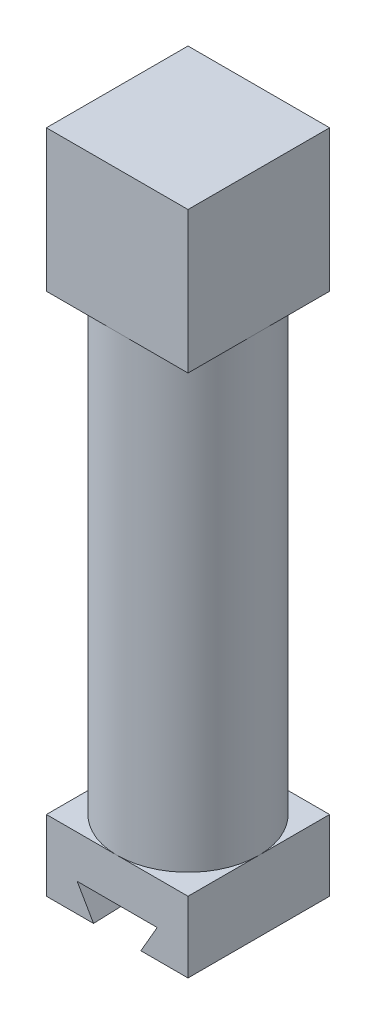
ISO-10303-21;
HEADER;
FILE_DESCRIPTION(('STEP AP214'),'2;1');
FILE_NAME('part.step','',(''),(''),'','','');
FILE_SCHEMA(('AUTOMOTIVE_DESIGN { 1 0 10303 214 1 1 1 1 }'));
ENDSEC;
DATA;
#1=APPLICATION_CONTEXT('core data for automotive mechanical design processes');
#2=APPLICATION_PROTOCOL_DEFINITION('international standard','automotive_design',2000,#1);
#3=PRODUCT_CONTEXT('',#1,'mechanical');
#4=PRODUCT('Part','Part','',(#3));
#5=PRODUCT_RELATED_PRODUCT_CATEGORY('part','',(#4));
#6=PRODUCT_DEFINITION_FORMATION('','',#4);
#7=PRODUCT_DEFINITION_CONTEXT('part definition',#1,'design');
#8=PRODUCT_DEFINITION('design','',#6,#7);
#9=PRODUCT_DEFINITION_SHAPE('','',#8);
#10=(LENGTH_UNIT() NAMED_UNIT(*) SI_UNIT(.MILLI.,.METRE.));
#11=(NAMED_UNIT(*) PLANE_ANGLE_UNIT() SI_UNIT($,.RADIAN.));
#12=(NAMED_UNIT(*) SI_UNIT($,.STERADIAN.) SOLID_ANGLE_UNIT());
#13=UNCERTAINTY_MEASURE_WITH_UNIT(LENGTH_MEASURE(1.E-05),#10,'distance_accuracy_value','');
#14=(GEOMETRIC_REPRESENTATION_CONTEXT(3) GLOBAL_UNCERTAINTY_ASSIGNED_CONTEXT((#13)) GLOBAL_UNIT_ASSIGNED_CONTEXT((#10,
#11,#12)) REPRESENTATION_CONTEXT('',''));
#15=CARTESIAN_POINT('',(0.,0.,0.));
#16=DIRECTION('',(0.,0.,1.));
#17=DIRECTION('',(1.,0.,0.));
#18=AXIS2_PLACEMENT_3D('',#15,#16,#17);
#19=CARTESIAN_POINT('',(7.93750000000012,73.0250002453149,-7.93750000000003));
#20=DIRECTION('',(0.,1.,0.));
#21=DIRECTION('',(0.,0.,1.));
#22=AXIS2_PLACEMENT_3D('',#19,#20,#21);
#23=PLANE('',#22);
#24=DIRECTION('',(-1.,0.,0.));
#25=VECTOR('',#24,1.);
#26=CARTESIAN_POINT('',(7.93750000000012,73.0250002453149,-7.93750000000003));
#27=LINE('',#26,#25);
#28=CARTESIAN_POINT('',(-7.93749999999988,73.0250002453149,-7.93750000000003));
#29=VERTEX_POINT('',#28);
#30=CARTESIAN_POINT('',(7.93750000000012,73.0250002453149,-7.93750000000003));
#31=VERTEX_POINT('',#30);
#32=EDGE_CURVE('E136',#29,#31,#27,.F.);
#33=ORIENTED_EDGE('',*,*,#32,.F.);
#34=DIRECTION('',(0.,0.,1.));
#35=VECTOR('',#34,1.);
#36=CARTESIAN_POINT('',(-7.93749999999988,73.0250002453149,-7.93750000000003));
#37=LINE('',#36,#35);
#38=CARTESIAN_POINT('',(-7.93749999999988,73.0250002453149,7.93749999999996));
#39=VERTEX_POINT('',#38);
#40=EDGE_CURVE('E173',#39,#29,#37,.F.);
#41=ORIENTED_EDGE('',*,*,#40,.F.);
#42=DIRECTION('',(-1.,0.,0.));
#43=VECTOR('',#42,1.);
#44=CARTESIAN_POINT('',(7.93750000000012,73.0250002453149,7.93749999999997));
#45=LINE('',#44,#43);
#46=CARTESIAN_POINT('',(7.93750000000012,73.0250002453149,7.93749999999997));
#47=VERTEX_POINT('',#46);
#48=EDGE_CURVE('E152',#39,#47,#45,.F.);
#49=ORIENTED_EDGE('',*,*,#48,.T.);
#50=DIRECTION('',(0.,0.,1.));
#51=VECTOR('',#50,1.);
#52=CARTESIAN_POINT('',(7.93750000000012,73.0250002453149,-7.93750000000003));
#53=LINE('',#52,#51);
#54=EDGE_CURVE('E151',#31,#47,#53,.T.);
#55=ORIENTED_EDGE('',*,*,#54,.F.);
#56=EDGE_LOOP('',(#33,#41,#49,#55));
#57=FACE_BOUND('',#56,.T.);
#58=ADVANCED_FACE('F18',(#57),#23,.T.);
#59=CARTESIAN_POINT('',(7.93750000000012,57.1500002453149,-7.93750000000003));
#60=DIRECTION('',(0.,0.,-1.));
#61=DIRECTION('',(-1.,0.,0.));
#62=AXIS2_PLACEMENT_3D('',#59,#60,#61);
#63=PLANE('',#62);
#64=DIRECTION('',(1.,0.,0.));
#65=VECTOR('',#64,1.);
#66=CARTESIAN_POINT('',(-7.93749999999988,57.1500002453149,-7.93750000000003));
#67=LINE('',#66,#65);
#68=CARTESIAN_POINT('',(-7.93749999999988,57.1500002453149,-7.93750000000003));
#69=VERTEX_POINT('',#68);
#70=CARTESIAN_POINT('',(0.,57.1500002453149,-7.93750000000002));
#71=VERTEX_POINT('',#70);
#72=EDGE_CURVE('E549',#69,#71,#67,.T.);
#73=ORIENTED_EDGE('',*,*,#72,.F.);
#74=DIRECTION('',(0.,1.,0.));
#75=VECTOR('',#74,1.);
#76=CARTESIAN_POINT('',(-7.93749999999988,73.0250002453149,-7.93750000000003));
#77=LINE('',#76,#75);
#78=EDGE_CURVE('E143',#29,#69,#77,.F.);
#79=ORIENTED_EDGE('',*,*,#78,.F.);
#80=ORIENTED_EDGE('',*,*,#32,.T.);
#81=DIRECTION('',(0.,1.,0.));
#82=VECTOR('',#81,1.);
#83=CARTESIAN_POINT('',(7.93750000000012,57.1500002453149,-7.93750000000003));
#84=LINE('',#83,#82);
#85=CARTESIAN_POINT('',(7.93750000000012,57.1500002453149,-7.93750000000003));
#86=VERTEX_POINT('',#85);
#87=EDGE_CURVE('E141',#86,#31,#84,.T.);
#88=ORIENTED_EDGE('',*,*,#87,.F.);
#89=DIRECTION('',(1.,0.,0.));
#90=VECTOR('',#89,1.);
#91=CARTESIAN_POINT('',(-7.93749999999988,57.1500002453149,-7.93750000000003));
#92=LINE('',#91,#90);
#93=EDGE_CURVE('E545',#71,#86,#92,.T.);
#94=ORIENTED_EDGE('',*,*,#93,.F.);
#95=EDGE_LOOP('',(#73,#79,#80,#88,#94));
#96=FACE_BOUND('',#95,.T.);
#97=ADVANCED_FACE('F139',(#96),#63,.T.);
#98=CARTESIAN_POINT('',(-7.93750031779463,-1.58749948953488,-7.9375));
#99=DIRECTION('',(0.,-1.,-2.44288301531891E-08));
#100=DIRECTION('',(0.,2.44288301531891E-08,-1.));
#101=AXIS2_PLACEMENT_3D('',#98,#99,#100);
#102=PLANE('',#101);
#103=DIRECTION('',(1.,0.,0.));
#104=VECTOR('',#103,1.);
#105=CARTESIAN_POINT('',(-9.53384196111795E-07,-1.58749987734256,7.9375));
#106=LINE('',#105,#104);
#107=CARTESIAN_POINT('',(-7.9375009533842,-1.58749974807333,7.9375));
#108=VERTEX_POINT('',#107);
#109=CARTESIAN_POINT('',(-2.65223024086649,-1.58749987734255,7.9375));
#110=VERTEX_POINT('',#109);
#111=EDGE_CURVE('E518',#108,#110,#106,.T.);
#112=ORIENTED_EDGE('',*,*,#111,.F.);
#113=DIRECTION('',(-4.00371376940711E-08,0.,0.999999999999999));
#114=VECTOR('',#113,1.);
#115=CARTESIAN_POINT('',(-7.93750031779463,-1.58749948953488,-7.9375));
#116=LINE('',#115,#114);
#117=CARTESIAN_POINT('',(-7.93750031779463,-1.58749948953488,-7.9375));
#118=VERTEX_POINT('',#117);
#119=EDGE_CURVE('E520',#118,#108,#116,.T.);
#120=ORIENTED_EDGE('',*,*,#119,.F.);
#121=DIRECTION('',(1.,0.,0.));
#122=VECTOR('',#121,1.);
#123=CARTESIAN_POINT('',(-3.17794646498282E-07,-1.58749948953488,-7.9375));
#124=LINE('',#123,#122);
#125=CARTESIAN_POINT('',(-3.20659682095837,-1.58749948953487,-7.9375));
#126=VERTEX_POINT('',#125);
#127=EDGE_CURVE('E198',#118,#126,#124,.T.);
#128=ORIENTED_EDGE('',*,*,#127,.T.);
#129=DIRECTION('',(-0.0348994567384849,2.4413947949231E-08,-0.999390828414669));
#130=VECTOR('',#129,1.);
#131=CARTESIAN_POINT('',(-2.65223024086648,-1.58749987734252,7.93750000000001));
#132=LINE('',#131,#130);
#133=EDGE_CURVE('E147',#110,#126,#132,.T.);
#134=ORIENTED_EDGE('',*,*,#133,.F.);
#135=EDGE_LOOP('',(#112,#120,#128,#134));
#136=FACE_BOUND('',#135,.T.);
#137=ADVANCED_FACE('F319',(#136),#102,.T.);
#138=CARTESIAN_POINT('',(-3.20659682095838,-1.58749948953486,-7.9375));
#139=DIRECTION('',(0.865629645161938,0.499771508652756,-0.0302284064377552));
#140=DIRECTION('',(-0.499999999999993,0.866025403784443,0.));
#141=AXIS2_PLACEMENT_3D('',#138,#139,#140);
#142=PLANE('',#141);
#143=DIRECTION('',(-0.499999999999987,0.866025403784446,0.));
#144=VECTOR('',#143,1.);
#145=CARTESIAN_POINT('',(-2.65223024086651,-1.58749987734254,7.9375));
#146=LINE('',#145,#144);
#147=CARTESIAN_POINT('',(-4.48531734554349,1.58750012265744,7.9375));
#148=VERTEX_POINT('',#147);
#149=EDGE_CURVE('E525',#110,#148,#146,.T.);
#150=ORIENTED_EDGE('',*,*,#149,.F.);
#151=ORIENTED_EDGE('',*,*,#133,.T.);
#152=DIRECTION('',(-0.499999999999993,0.866025403784442,0.));
#153=VECTOR('',#152,1.);
#154=CARTESIAN_POINT('',(-3.20659682095838,-1.58749948953486,-7.9375));
#155=LINE('',#154,#153);
#156=CARTESIAN_POINT('',(-5.03968392563541,1.58750051046514,-7.9375));
#157=VERTEX_POINT('',#156);
#158=EDGE_CURVE('E194',#126,#157,#155,.T.);
#159=ORIENTED_EDGE('',*,*,#158,.T.);
#160=DIRECTION('',(-0.0348994567384863,2.44139502016327E-08,-0.999390828414669));
#161=VECTOR('',#160,1.);
#162=CARTESIAN_POINT('',(-4.48531734554349,1.58750012265744,7.9375));
#163=LINE('',#162,#161);
#164=EDGE_CURVE('E607',#148,#157,#163,.T.);
#165=ORIENTED_EDGE('',*,*,#164,.F.);
#166=EDGE_LOOP('',(#150,#151,#159,#165));
#167=FACE_BOUND('',#166,.T.);
#168=ADVANCED_FACE('F315',(#167),#142,.T.);
#169=CARTESIAN_POINT('',(-5.03968392563541,1.58750051046514,-7.9375));
#170=DIRECTION('',(0.,-1.,-2.44288315575337E-08));
#171=DIRECTION('',(0.,2.44288315575337E-08,-1.));
#172=AXIS2_PLACEMENT_3D('',#169,#170,#171);
#173=PLANE('',#172);
#174=DIRECTION('',(1.,0.,0.));
#175=VECTOR('',#174,1.);
#176=CARTESIAN_POINT('',(-9.53384196111795E-07,1.58750012265744,7.9375));
#177=LINE('',#176,#175);
#178=CARTESIAN_POINT('',(4.48531543877511,1.58750012265744,7.9375));
#179=VERTEX_POINT('',#178);
#180=EDGE_CURVE('E601',#148,#179,#177,.T.);
#181=ORIENTED_EDGE('',*,*,#180,.F.);
#182=ORIENTED_EDGE('',*,*,#164,.T.);
#183=DIRECTION('',(1.,0.,0.));
#184=VECTOR('',#183,1.);
#185=CARTESIAN_POINT('',(-3.17794646498282E-07,1.58750051046514,-7.9375));
#186=LINE('',#185,#184);
#187=CARTESIAN_POINT('',(5.03968329004614,1.58750051046514,-7.9375));
#188=VERTEX_POINT('',#187);
#189=EDGE_CURVE('E190',#157,#188,#186,.T.);
#190=ORIENTED_EDGE('',*,*,#189,.T.);
#191=DIRECTION('',(0.034899536666512,2.4413951020758E-08,-0.999390825623521));
#192=VECTOR('',#191,1.);
#193=CARTESIAN_POINT('',(4.48531543877512,1.58750012265743,7.9375));
#194=LINE('',#193,#192);
#195=EDGE_CURVE('E604',#179,#188,#194,.T.);
#196=ORIENTED_EDGE('',*,*,#195,.F.);
#197=EDGE_LOOP('',(#181,#182,#190,#196));
#198=FACE_BOUND('',#197,.T.);
#199=ADVANCED_FACE('F311',(#198),#173,.T.);
#200=CARTESIAN_POINT('',(5.03968329004614,1.58750051046514,-7.9375));
#201=DIRECTION('',(-0.865629643348206,0.499771507605598,-0.0302284756890831));
#202=DIRECTION('',(-0.499999999999993,-0.866025403784442,0.));
#203=AXIS2_PLACEMENT_3D('',#200,#201,#202);
#204=PLANE('',#203);
#205=DIRECTION('',(-0.499999999999987,-0.866025403784446,0.));
#206=VECTOR('',#205,1.);
#207=CARTESIAN_POINT('',(4.4853154387751,1.58750012265744,7.9375));
#208=LINE('',#207,#206);
#209=CARTESIAN_POINT('',(2.65222833409811,-1.58749987734253,7.9375));
#210=VERTEX_POINT('',#209);
#211=EDGE_CURVE('E579',#179,#210,#208,.T.);
#212=ORIENTED_EDGE('',*,*,#211,.F.);
#213=ORIENTED_EDGE('',*,*,#195,.T.);
#214=DIRECTION('',(-0.499999999999993,-0.866025403784442,0.));
#215=VECTOR('',#214,1.);
#216=CARTESIAN_POINT('',(5.03968329004614,1.58750051046514,-7.9375));
#217=LINE('',#216,#215);
#218=CARTESIAN_POINT('',(3.20659618536911,-1.58749948953486,-7.9375));
#219=VERTEX_POINT('',#218);
#220=EDGE_CURVE('E188',#188,#219,#217,.T.);
#221=ORIENTED_EDGE('',*,*,#220,.T.);
#222=DIRECTION('',(0.0348995366665107,2.44139487547054E-08,-0.999390825623521));
#223=VECTOR('',#222,1.);
#224=CARTESIAN_POINT('',(2.65222833409811,-1.58749987734254,7.9375));
#225=LINE('',#224,#223);
#226=EDGE_CURVE('E160',#210,#219,#225,.T.);
#227=ORIENTED_EDGE('',*,*,#226,.F.);
#228=EDGE_LOOP('',(#212,#213,#221,#227));
#229=FACE_BOUND('',#228,.T.);
#230=ADVANCED_FACE('F307',(#229),#204,.T.);
#231=CARTESIAN_POINT('',(-3.17794646498282E-07,2.38110905435227,-7.9375));
#232=DIRECTION('',(0.,0.,1.));
#233=DIRECTION('',(1.,0.,0.));
#234=AXIS2_PLACEMENT_3D('',#231,#232,#233);
#235=PLANE('',#234);
#236=DIRECTION('',(1.,0.,0.));
#237=VECTOR('',#236,1.);
#238=CARTESIAN_POINT('',(7.93749968220534,6.35000051046514,-7.9375));
#239=LINE('',#238,#237);
#240=CARTESIAN_POINT('',(0.,6.35000037789003,-7.9375));
#241=VERTEX_POINT('',#240);
#242=CARTESIAN_POINT('',(-7.93750031779464,6.35000041351322,-7.9375));
#243=VERTEX_POINT('',#242);
#244=EDGE_CURVE('E559',#241,#243,#239,.F.);
#245=ORIENTED_EDGE('',*,*,#244,.F.);
#246=DIRECTION('',(1.,0.,0.));
#247=VECTOR('',#246,1.);
#248=CARTESIAN_POINT('',(7.93749968220534,6.35000051046514,-7.9375));
#249=LINE('',#248,#247);
#250=CARTESIAN_POINT('',(7.9374997881369,6.35000051046514,-7.9375));
#251=VERTEX_POINT('',#250);
#252=EDGE_CURVE('E172',#251,#241,#249,.F.);
#253=ORIENTED_EDGE('',*,*,#252,.F.);
#254=DIRECTION('',(0.,1.,0.));
#255=VECTOR('',#254,1.);
#256=CARTESIAN_POINT('',(7.93749968220534,-1.58749948953486,-7.9375));
#257=LINE('',#256,#255);
#258=CARTESIAN_POINT('',(7.93749968220534,-1.5874996834387,-7.9375));
#259=VERTEX_POINT('',#258);
#260=EDGE_CURVE('E578',#259,#251,#257,.T.);
#261=ORIENTED_EDGE('',*,*,#260,.F.);
#262=DIRECTION('',(1.,0.,0.));
#263=VECTOR('',#262,1.);
#264=CARTESIAN_POINT('',(3.20659618536911,-1.58749948953486,-7.9375));
#265=LINE('',#264,#263);
#266=EDGE_CURVE('E163',#219,#259,#265,.T.);
#267=ORIENTED_EDGE('',*,*,#266,.F.);
#268=ORIENTED_EDGE('',*,*,#220,.F.);
#269=ORIENTED_EDGE('',*,*,#189,.F.);
#270=ORIENTED_EDGE('',*,*,#158,.F.);
#271=ORIENTED_EDGE('',*,*,#127,.F.);
#272=DIRECTION('',(0.,1.,0.));
#273=VECTOR('',#272,1.);
#274=CARTESIAN_POINT('',(-7.93750031779463,6.35000051046514,-7.9375));
#275=LINE('',#274,#273);
#276=EDGE_CURVE('E544',#243,#118,#275,.F.);
#277=ORIENTED_EDGE('',*,*,#276,.F.);
#278=EDGE_LOOP('',(#245,#253,#261,#267,#268,#269,#270,#271,#277));
#279=FACE_BOUND('',#278,.T.);
#280=ADVANCED_FACE('F303',(#279),#235,.F.);
#281=CARTESIAN_POINT('',(3.20659618536911,-1.58749948953486,-7.9375));
#282=DIRECTION('',(0.,-1.,-2.4428830166427E-08));
#283=DIRECTION('',(0.,2.4428830166427E-08,-1.));
#284=AXIS2_PLACEMENT_3D('',#281,#282,#283);
#285=PLANE('',#284);
#286=DIRECTION('',(1.,0.,0.));
#287=VECTOR('',#286,1.);
#288=CARTESIAN_POINT('',(-9.53384196111795E-07,-1.58749987734254,7.9375));
#289=LINE('',#288,#287);
#290=CARTESIAN_POINT('',(7.9374990466158,-1.58749987734253,7.9375));
#291=VERTEX_POINT('',#290);
#292=EDGE_CURVE('E576',#210,#291,#289,.T.);
#293=ORIENTED_EDGE('',*,*,#292,.F.);
#294=ORIENTED_EDGE('',*,*,#226,.T.);
#295=ORIENTED_EDGE('',*,*,#266,.T.);
#296=DIRECTION('',(4.00371362729857E-08,0.,-0.999999999999999));
#297=VECTOR('',#296,1.);
#298=CARTESIAN_POINT('',(7.93749968220534,-1.58749987734253,-7.9375));
#299=LINE('',#298,#297);
#300=EDGE_CURVE('E582',#291,#259,#299,.T.);
#301=ORIENTED_EDGE('',*,*,#300,.F.);
#302=EDGE_LOOP('',(#293,#294,#295,#301));
#303=FACE_BOUND('',#302,.T.);
#304=ADVANCED_FACE('F300',(#303),#285,.T.);
#305=CARTESIAN_POINT('',(7.93750000000012,57.1500002453149,-7.93750000000003));
#306=DIRECTION('',(1.,0.,0.));
#307=DIRECTION('',(0.,1.,0.));
#308=AXIS2_PLACEMENT_3D('',#305,#306,#307);
#309=PLANE('',#308);
#310=ORIENTED_EDGE('',*,*,#87,.T.);
#311=ORIENTED_EDGE('',*,*,#54,.T.);
#312=DIRECTION('',(0.,1.,0.));
#313=VECTOR('',#312,1.);
#314=CARTESIAN_POINT('',(7.93750000000012,57.1500002453149,7.93749999999997));
#315=LINE('',#314,#313);
#316=CARTESIAN_POINT('',(7.93750000000004,57.1500002453149,7.93749999999997));
#317=VERTEX_POINT('',#316);
#318=EDGE_CURVE('E183',#47,#317,#315,.F.);
#319=ORIENTED_EDGE('',*,*,#318,.T.);
#320=DIRECTION('',(0.,0.,-1.));
#321=VECTOR('',#320,1.);
#322=CARTESIAN_POINT('',(7.9375,57.1500002453149,-7.93750000000003));
#323=LINE('',#322,#321);
#324=CARTESIAN_POINT('',(7.93750000000006,57.1500002453149,0.));
#325=VERTEX_POINT('',#324);
#326=EDGE_CURVE('E585',#325,#317,#323,.F.);
#327=ORIENTED_EDGE('',*,*,#326,.F.);
#328=DIRECTION('',(0.,0.,-1.));
#329=VECTOR('',#328,1.);
#330=CARTESIAN_POINT('',(7.93750000000012,57.1500002453149,-7.93750000000003));
#331=LINE('',#330,#329);
#332=EDGE_CURVE('E158',#86,#325,#331,.F.);
#333=ORIENTED_EDGE('',*,*,#332,.F.);
#334=EDGE_LOOP('',(#310,#311,#319,#327,#333));
#335=FACE_BOUND('',#334,.T.);
#336=ADVANCED_FACE('F156',(#335),#309,.T.);
#337=CARTESIAN_POINT('',(7.93750000000012,57.1500002453149,7.93749999999997));
#338=DIRECTION('',(0.,0.,-1.));
#339=DIRECTION('',(-1.,0.,0.));
#340=AXIS2_PLACEMENT_3D('',#337,#338,#339);
#341=PLANE('',#340);
#342=DIRECTION('',(1.,0.,0.));
#343=VECTOR('',#342,1.);
#344=CARTESIAN_POINT('',(-7.93749999999988,57.1500002453149,7.93749999999997));
#345=LINE('',#344,#343);
#346=CARTESIAN_POINT('',(0.,57.1500002453149,7.93749999999998));
#347=VERTEX_POINT('',#346);
#348=CARTESIAN_POINT('',(-7.93749999999988,57.1500002453149,7.93749999999997));
#349=VERTEX_POINT('',#348);
#350=EDGE_CURVE('E654',#347,#349,#345,.F.);
#351=ORIENTED_EDGE('',*,*,#350,.F.);
#352=DIRECTION('',(1.,0.,0.));
#353=VECTOR('',#352,1.);
#354=CARTESIAN_POINT('',(-7.93749999999988,57.1500002453149,7.93749999999997));
#355=LINE('',#354,#353);
#356=EDGE_CURVE('E649',#317,#347,#355,.F.);
#357=ORIENTED_EDGE('',*,*,#356,.F.);
#358=ORIENTED_EDGE('',*,*,#318,.F.);
#359=ORIENTED_EDGE('',*,*,#48,.F.);
#360=DIRECTION('',(0.,1.,0.));
#361=VECTOR('',#360,1.);
#362=CARTESIAN_POINT('',(-7.93749999999989,73.0250002453149,7.93749999999996));
#363=LINE('',#362,#361);
#364=EDGE_CURVE('E179',#349,#39,#363,.T.);
#365=ORIENTED_EDGE('',*,*,#364,.F.);
#366=EDGE_LOOP('',(#351,#357,#358,#359,#365));
#367=FACE_BOUND('',#366,.T.);
#368=ADVANCED_FACE('F293',(#367),#341,.F.);
#369=CARTESIAN_POINT('',(-7.93749999999988,73.0250002453149,-7.93750000000003));
#370=DIRECTION('',(-1.,0.,0.));
#371=DIRECTION('',(0.,0.,1.));
#372=AXIS2_PLACEMENT_3D('',#369,#370,#371);
#373=PLANE('',#372);
#374=DIRECTION('',(0.,0.,-1.));
#375=VECTOR('',#374,1.);
#376=CARTESIAN_POINT('',(-7.93749999999988,57.1500002453149,-7.93750000000003));
#377=LINE('',#376,#375);
#378=CARTESIAN_POINT('',(-7.93749999999994,57.1500002453149,0.));
#379=VERTEX_POINT('',#378);
#380=EDGE_CURVE('E554',#379,#69,#377,.T.);
#381=ORIENTED_EDGE('',*,*,#380,.F.);
#382=DIRECTION('',(0.,0.,-1.));
#383=VECTOR('',#382,1.);
#384=CARTESIAN_POINT('',(-7.93749999999988,57.1500002453149,-7.93750000000003));
#385=LINE('',#384,#383);
#386=EDGE_CURVE('E220',#349,#379,#385,.T.);
#387=ORIENTED_EDGE('',*,*,#386,.F.);
#388=ORIENTED_EDGE('',*,*,#364,.T.);
#389=ORIENTED_EDGE('',*,*,#40,.T.);
#390=ORIENTED_EDGE('',*,*,#78,.T.);
#391=EDGE_LOOP('',(#381,#387,#388,#389,#390));
#392=FACE_BOUND('',#391,.T.);
#393=ADVANCED_FACE('F290',(#392),#373,.T.);
#394=CARTESIAN_POINT('',(7.93749968220534,6.35000051046514,-7.9375));
#395=DIRECTION('',(0.,1.,2.44288316797459E-08));
#396=DIRECTION('',(0.,-2.44288316797459E-08,1.));
#397=AXIS2_PLACEMENT_3D('',#394,#395,#396);
#398=PLANE('',#397);
#399=DIRECTION('',(4.00371362729857E-08,0.,-0.999999999999999));
#400=VECTOR('',#399,1.);
#401=CARTESIAN_POINT('',(7.93749968220534,6.35000051046514,-7.9375));
#402=LINE('',#401,#400);
#403=CARTESIAN_POINT('',(7.9374995233079,6.35000018398618,0.));
#404=VERTEX_POINT('',#403);
#405=EDGE_CURVE('E590',#251,#404,#402,.F.);
#406=ORIENTED_EDGE('',*,*,#405,.F.);
#407=ORIENTED_EDGE('',*,*,#252,.T.);
#408=CARTESIAN_POINT('',(0.,6.35000024531491,0.));
#409=DIRECTION('',(0.,-1.,0.));
#410=DIRECTION('',(0.,0.,-1.));
#411=AXIS2_PLACEMENT_3D('',#408,#409,#410);
#412=CIRCLE('',#411,7.9375);
#413=EDGE_CURVE('E63',#404,#241,#412,.F.);
#414=ORIENTED_EDGE('',*,*,#413,.F.);
#415=EDGE_LOOP('',(#406,#407,#414));
#416=FACE_BOUND('',#415,.T.);
#417=ADVANCED_FACE('F286',(#416),#398,.T.);
#418=CARTESIAN_POINT('',(7.93749968220534,6.35000051046514,-7.9375));
#419=DIRECTION('',(0.,1.,2.44288316797459E-08));
#420=DIRECTION('',(0.,-2.44288316797459E-08,1.));
#421=AXIS2_PLACEMENT_3D('',#418,#419,#420);
#422=PLANE('',#421);
#423=ORIENTED_EDGE('',*,*,#244,.T.);
#424=DIRECTION('',(-4.00371376940711E-08,0.,0.999999999999999));
#425=VECTOR('',#424,1.);
#426=CARTESIAN_POINT('',(-7.93750031779463,6.3500003165613,-7.9375));
#427=LINE('',#426,#425);
#428=CARTESIAN_POINT('',(-7.9375003177947,6.35000041351322,-1.5889739090428E-07));
#429=VERTEX_POINT('',#428);
#430=EDGE_CURVE('E531',#429,#243,#427,.F.);
#431=ORIENTED_EDGE('',*,*,#430,.F.);
#432=CARTESIAN_POINT('',(0.,6.35000051046514,0.));
#433=DIRECTION('',(0.,-1.,0.));
#434=DIRECTION('',(0.,0.,-1.));
#435=AXIS2_PLACEMENT_3D('',#432,#433,#434);
#436=CIRCLE('',#435,7.9375);
#437=EDGE_CURVE('E217',#241,#429,#436,.F.);
#438=ORIENTED_EDGE('',*,*,#437,.F.);
#439=EDGE_LOOP('',(#423,#431,#438));
#440=FACE_BOUND('',#439,.T.);
#441=ADVANCED_FACE('F282',(#440),#422,.T.);
#442=CARTESIAN_POINT('',(-7.93749999999988,57.1500002453149,-7.93750000000003));
#443=DIRECTION('',(0.,-1.,0.));
#444=DIRECTION('',(0.,0.,-1.));
#445=AXIS2_PLACEMENT_3D('',#442,#443,#444);
#446=PLANE('',#445);
#447=ORIENTED_EDGE('',*,*,#380,.T.);
#448=ORIENTED_EDGE('',*,*,#72,.T.);
#449=CARTESIAN_POINT('',(0.,57.1500002453149,0.));
#450=DIRECTION('',(0.,-1.,0.));
#451=DIRECTION('',(0.,0.,-1.));
#452=AXIS2_PLACEMENT_3D('',#449,#450,#451);
#453=CIRCLE('',#452,7.9375);
#454=EDGE_CURVE('E214',#379,#71,#453,.T.);
#455=ORIENTED_EDGE('',*,*,#454,.F.);
#456=EDGE_LOOP('',(#447,#448,#455));
#457=FACE_BOUND('',#456,.T.);
#458=ADVANCED_FACE('F278',(#457),#446,.T.);
#459=CARTESIAN_POINT('',(-7.93749999999988,57.1500002453149,-7.93750000000003));
#460=DIRECTION('',(0.,-1.,0.));
#461=DIRECTION('',(0.,0.,-1.));
#462=AXIS2_PLACEMENT_3D('',#459,#460,#461);
#463=PLANE('',#462);
#464=ORIENTED_EDGE('',*,*,#93,.T.);
#465=ORIENTED_EDGE('',*,*,#332,.T.);
#466=CARTESIAN_POINT('',(0.,57.1500002453149,0.));
#467=DIRECTION('',(0.,-1.,0.));
#468=DIRECTION('',(0.,0.,-1.));
#469=AXIS2_PLACEMENT_3D('',#466,#467,#468);
#470=CIRCLE('',#469,7.9375);
#471=EDGE_CURVE('E210',#71,#325,#470,.T.);
#472=ORIENTED_EDGE('',*,*,#471,.F.);
#473=EDGE_LOOP('',(#464,#465,#472));
#474=FACE_BOUND('',#473,.T.);
#475=ADVANCED_FACE('F274',(#474),#463,.T.);
#476=CARTESIAN_POINT('',(-7.93750031779463,6.35000051046514,-7.9375));
#477=DIRECTION('',(-0.999999999999999,0.,-4.00371376940711E-08));
#478=DIRECTION('',(-4.00371376940711E-08,0.,0.999999999999999));
#479=AXIS2_PLACEMENT_3D('',#476,#477,#478);
#480=PLANE('',#479);
#481=DIRECTION('',(0.,-2.44288316797459E-08,1.));
#482=VECTOR('',#481,1.);
#483=CARTESIAN_POINT('',(-7.93750063558941,6.35000051046514,-7.9375));
#484=LINE('',#483,#482);
#485=CARTESIAN_POINT('',(-7.93750074152101,6.35000012265744,7.9375));
#486=VERTEX_POINT('',#485);
#487=EDGE_CURVE('E213',#429,#486,#484,.T.);
#488=ORIENTED_EDGE('',*,*,#487,.F.);
#489=ORIENTED_EDGE('',*,*,#430,.T.);
#490=ORIENTED_EDGE('',*,*,#276,.T.);
#491=ORIENTED_EDGE('',*,*,#119,.T.);
#492=DIRECTION('',(0.,1.,0.));
#493=VECTOR('',#492,1.);
#494=CARTESIAN_POINT('',(-7.9375009533842,2.32106055510796,7.9375));
#495=LINE('',#494,#493);
#496=EDGE_CURVE('E526',#486,#108,#495,.F.);
#497=ORIENTED_EDGE('',*,*,#496,.F.);
#498=EDGE_LOOP('',(#488,#489,#490,#491,#497));
#499=FACE_BOUND('',#498,.T.);
#500=ADVANCED_FACE('F271',(#499),#480,.T.);
#501=CARTESIAN_POINT('',(-9.53384196111795E-07,2.32106055510796,7.9375));
#502=DIRECTION('',(0.,0.,1.));
#503=DIRECTION('',(1.,0.,0.));
#504=AXIS2_PLACEMENT_3D('',#501,#502,#503);
#505=PLANE('',#504);
#506=DIRECTION('',(1.,0.,0.));
#507=VECTOR('',#506,1.);
#508=CARTESIAN_POINT('',(7.93749968220534,6.35000012265744,7.9375));
#509=LINE('',#508,#507);
#510=CARTESIAN_POINT('',(0.,6.35000021960937,7.93750000000001));
#511=VERTEX_POINT('',#510);
#512=CARTESIAN_POINT('',(7.9374990466158,6.35000012265744,7.9375));
#513=VERTEX_POINT('',#512);
#514=EDGE_CURVE('E36',#511,#513,#509,.T.);
#515=ORIENTED_EDGE('',*,*,#514,.F.);
#516=DIRECTION('',(1.,0.,0.));
#517=VECTOR('',#516,1.);
#518=CARTESIAN_POINT('',(7.93749968220534,6.35000012265744,7.9375));
#519=LINE('',#518,#517);
#520=EDGE_CURVE('E528',#486,#511,#519,.T.);
#521=ORIENTED_EDGE('',*,*,#520,.F.);
#522=ORIENTED_EDGE('',*,*,#496,.T.);
#523=ORIENTED_EDGE('',*,*,#111,.T.);
#524=ORIENTED_EDGE('',*,*,#149,.T.);
#525=ORIENTED_EDGE('',*,*,#180,.T.);
#526=ORIENTED_EDGE('',*,*,#211,.T.);
#527=ORIENTED_EDGE('',*,*,#292,.T.);
#528=DIRECTION('',(0.,1.,0.));
#529=VECTOR('',#528,1.);
#530=CARTESIAN_POINT('',(7.9374990466158,-1.58749948953486,7.9375));
#531=LINE('',#530,#529);
#532=EDGE_CURVE('E68',#513,#291,#531,.F.);
#533=ORIENTED_EDGE('',*,*,#532,.F.);
#534=EDGE_LOOP('',(#515,#521,#522,#523,#524,#525,#526,#527,#533));
#535=FACE_BOUND('',#534,.T.);
#536=ADVANCED_FACE('F267',(#535),#505,.T.);
#537=CARTESIAN_POINT('',(7.93749968220534,-1.58749948953486,-7.9375));
#538=DIRECTION('',(0.999999999999999,0.,4.00371362729857E-08));
#539=DIRECTION('',(4.00371362729857E-08,0.,-0.999999999999999));
#540=AXIS2_PLACEMENT_3D('',#537,#538,#539);
#541=PLANE('',#540);
#542=ORIENTED_EDGE('',*,*,#532,.T.);
#543=ORIENTED_EDGE('',*,*,#300,.T.);
#544=ORIENTED_EDGE('',*,*,#260,.T.);
#545=ORIENTED_EDGE('',*,*,#405,.T.);
#546=DIRECTION('',(0.,-2.44288316797459E-08,1.));
#547=VECTOR('',#546,1.);
#548=CARTESIAN_POINT('',(7.9374990466158,6.35000051046514,-7.9375));
#549=LINE('',#548,#547);
#550=EDGE_CURVE('E209',#513,#404,#549,.F.);
#551=ORIENTED_EDGE('',*,*,#550,.F.);
#552=EDGE_LOOP('',(#542,#543,#544,#545,#551));
#553=FACE_BOUND('',#552,.T.);
#554=ADVANCED_FACE('F263',(#553),#541,.T.);
#555=CARTESIAN_POINT('',(-7.93749999999988,57.1500002453149,-7.93750000000003));
#556=DIRECTION('',(0.,-1.,0.));
#557=DIRECTION('',(0.,0.,-1.));
#558=AXIS2_PLACEMENT_3D('',#555,#556,#557);
#559=PLANE('',#558);
#560=ORIENTED_EDGE('',*,*,#326,.T.);
#561=ORIENTED_EDGE('',*,*,#356,.T.);
#562=CARTESIAN_POINT('',(0.,57.1500002453149,0.));
#563=DIRECTION('',(0.,-1.,0.));
#564=DIRECTION('',(0.,0.,-1.));
#565=AXIS2_PLACEMENT_3D('',#562,#563,#564);
#566=CIRCLE('',#565,7.9375);
#567=EDGE_CURVE('E206',#325,#347,#566,.T.);
#568=ORIENTED_EDGE('',*,*,#567,.F.);
#569=EDGE_LOOP('',(#560,#561,#568));
#570=FACE_BOUND('',#569,.T.);
#571=ADVANCED_FACE('F259',(#570),#559,.T.);
#572=CARTESIAN_POINT('',(-7.93749999999988,57.1500002453149,-7.93750000000003));
#573=DIRECTION('',(0.,-1.,0.));
#574=DIRECTION('',(0.,0.,-1.));
#575=AXIS2_PLACEMENT_3D('',#572,#573,#574);
#576=PLANE('',#575);
#577=ORIENTED_EDGE('',*,*,#350,.T.);
#578=ORIENTED_EDGE('',*,*,#386,.T.);
#579=CARTESIAN_POINT('',(0.,57.1500002453149,0.));
#580=DIRECTION('',(0.,-1.,0.));
#581=DIRECTION('',(0.,0.,-1.));
#582=AXIS2_PLACEMENT_3D('',#579,#580,#581);
#583=CIRCLE('',#582,7.9375);
#584=EDGE_CURVE('E203',#347,#379,#583,.T.);
#585=ORIENTED_EDGE('',*,*,#584,.F.);
#586=EDGE_LOOP('',(#577,#578,#585));
#587=FACE_BOUND('',#586,.T.);
#588=ADVANCED_FACE('F255',(#587),#576,.T.);
#589=CARTESIAN_POINT('',(7.93749968220534,6.35000051046514,-7.9375));
#590=DIRECTION('',(0.,1.,2.44288316797459E-08));
#591=DIRECTION('',(0.,-2.44288316797459E-08,1.));
#592=AXIS2_PLACEMENT_3D('',#589,#590,#591);
#593=PLANE('',#592);
#594=ORIENTED_EDGE('',*,*,#487,.T.);
#595=ORIENTED_EDGE('',*,*,#520,.T.);
#596=CARTESIAN_POINT('',(0.,6.3500003165613,0.));
#597=DIRECTION('',(0.,-1.,0.));
#598=DIRECTION('',(0.,0.,-1.));
#599=AXIS2_PLACEMENT_3D('',#596,#597,#598);
#600=CIRCLE('',#599,7.9375);
#601=EDGE_CURVE('E27',#429,#511,#600,.F.);
#602=ORIENTED_EDGE('',*,*,#601,.F.);
#603=EDGE_LOOP('',(#594,#595,#602));
#604=FACE_BOUND('',#603,.T.);
#605=ADVANCED_FACE('F251',(#604),#593,.T.);
#606=CARTESIAN_POINT('',(7.93749968220534,6.35000051046514,-7.9375));
#607=DIRECTION('',(0.,1.,2.44288316797459E-08));
#608=DIRECTION('',(0.,-2.44288316797459E-08,1.));
#609=AXIS2_PLACEMENT_3D('',#606,#607,#608);
#610=PLANE('',#609);
#611=ORIENTED_EDGE('',*,*,#514,.T.);
#612=ORIENTED_EDGE('',*,*,#550,.T.);
#613=CARTESIAN_POINT('',(0.,6.35000012265744,0.));
#614=DIRECTION('',(0.,-1.,0.));
#615=DIRECTION('',(0.,0.,-1.));
#616=AXIS2_PLACEMENT_3D('',#613,#614,#615);
#617=CIRCLE('',#616,7.9375);
#618=EDGE_CURVE('E11',#511,#404,#617,.F.);
#619=ORIENTED_EDGE('',*,*,#618,.F.);
#620=EDGE_LOOP('',(#611,#612,#619));
#621=FACE_BOUND('',#620,.T.);
#622=ADVANCED_FACE('F247',(#621),#610,.T.);
#623=CARTESIAN_POINT('',(0.,6.35000024531491,0.));
#624=DIRECTION('',(0.,-1.,0.));
#625=DIRECTION('',(0.,0.,-1.));
#626=AXIS2_PLACEMENT_3D('',#623,#624,#625);
#627=CYLINDRICAL_SURFACE('',#626,7.9375);
#628=ORIENTED_EDGE('',*,*,#471,.T.);
#629=ORIENTED_EDGE('',*,*,#567,.T.);
#630=ORIENTED_EDGE('',*,*,#584,.T.);
#631=ORIENTED_EDGE('',*,*,#454,.T.);
#632=EDGE_LOOP('',(#628,#629,#630,#631));
#633=FACE_BOUND('',#632,.T.);
#634=ORIENTED_EDGE('',*,*,#601,.T.);
#635=ORIENTED_EDGE('',*,*,#618,.T.);
#636=ORIENTED_EDGE('',*,*,#413,.T.);
#637=ORIENTED_EDGE('',*,*,#437,.T.);
#638=EDGE_LOOP('',(#634,#635,#636,#637));
#639=FACE_BOUND('',#638,.T.);
#640=ADVANCED_FACE('F244',(#633,#639),#627,.T.);
#641=CLOSED_SHELL('',(#58,#97,#137,#168,#199,#230,#280,#304,#336,#368,#393,#417,#441,#458,#475,
#500,#536,#554,#571,#588,#605,#622,#640));
#642=CARTESIAN_POINT('',(7.93749968220534,6.35000051046514,-7.9375));
#643=DIRECTION('',(0.,1.,2.44288316797459E-08));
#644=DIRECTION('',(0.,-2.44288316797459E-08,1.));
#645=AXIS2_PLACEMENT_3D('',#642,#643,#644);
#646=PLANE('',#645);
#647=CARTESIAN_POINT('',(0.,6.35000024531491,0.));
#648=DIRECTION('',(0.,-1.,0.));
#649=DIRECTION('',(0.,0.,-1.));
#650=AXIS2_PLACEMENT_3D('',#647,#648,#649);
#651=CIRCLE('',#650,7.2263);
#652=CARTESIAN_POINT('',(0.,6.35000024531491,-7.2263));
#653=VERTEX_POINT('',#652);
#654=EDGE_CURVE('E148',#653,#653,#651,.F.);
#655=ORIENTED_EDGE('',*,*,#654,.T.);
#656=EDGE_LOOP('',(#655));
#657=FACE_BOUND('',#656,.T.);
#658=ADVANCED_FACE('F238',(#657),#646,.T.);
#659=CARTESIAN_POINT('',(-7.93749999999988,57.1500002453149,-7.93750000000003));
#660=DIRECTION('',(0.,-1.,0.));
#661=DIRECTION('',(0.,0.,-1.));
#662=AXIS2_PLACEMENT_3D('',#659,#660,#661);
#663=PLANE('',#662);
#664=CARTESIAN_POINT('',(0.,57.1500002453149,0.));
#665=DIRECTION('',(0.,-1.,0.));
#666=DIRECTION('',(0.,0.,-1.));
#667=AXIS2_PLACEMENT_3D('',#664,#665,#666);
#668=CIRCLE('',#667,7.2263);
#669=CARTESIAN_POINT('',(0.,57.1500002453149,-7.2263));
#670=VERTEX_POINT('',#669);
#671=EDGE_CURVE('E21',#670,#670,#668,.T.);
#672=ORIENTED_EDGE('',*,*,#671,.T.);
#673=EDGE_LOOP('',(#672));
#674=FACE_BOUND('',#673,.T.);
#675=ADVANCED_FACE('F227',(#674),#663,.T.);
#676=CARTESIAN_POINT('',(0.,6.35000024531491,0.));
#677=DIRECTION('',(0.,-1.,0.));
#678=DIRECTION('',(0.,0.,-1.));
#679=AXIS2_PLACEMENT_3D('',#676,#677,#678);
#680=CYLINDRICAL_SURFACE('',#679,7.2263);
#681=ORIENTED_EDGE('',*,*,#671,.F.);
#682=EDGE_LOOP('',(#681));
#683=FACE_BOUND('',#682,.T.);
#684=ORIENTED_EDGE('',*,*,#654,.F.);
#685=EDGE_LOOP('',(#684));
#686=FACE_BOUND('',#685,.T.);
#687=ADVANCED_FACE('F229',(#683,#686),#680,.F.);
#688=CLOSED_SHELL('',(#658,#675,#687));
#689=ORIENTED_CLOSED_SHELL('',*,#688,.T.);
#690=BREP_WITH_VOIDS('B1',#641,(#689));
#691=ADVANCED_BREP_SHAPE_REPRESENTATION('',(#18,#690),#14);
#692=SHAPE_DEFINITION_REPRESENTATION(#9,#691);
ENDSEC;
END-ISO-10303-21;
